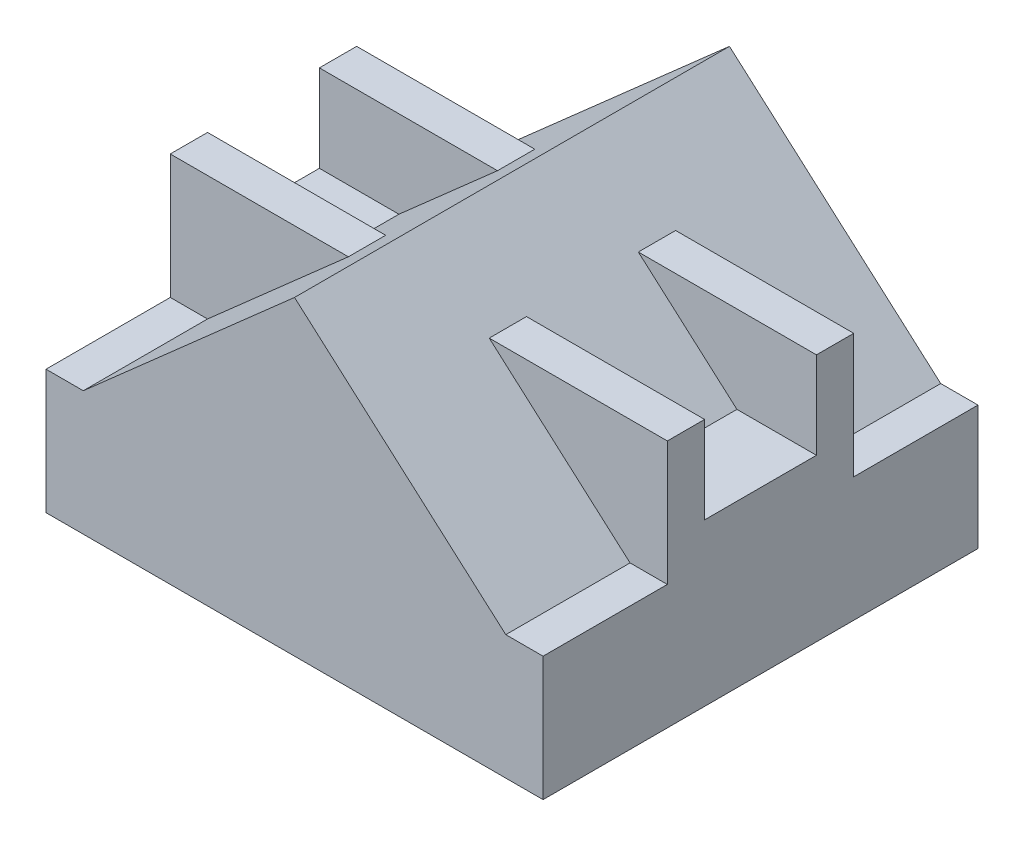
ISO-10303-21;
HEADER;
FILE_DESCRIPTION(('STEP AP214'),'2;1');
FILE_NAME('part.step','',(''),(''),'','','');
FILE_SCHEMA(('AUTOMOTIVE_DESIGN { 1 0 10303 214 1 1 1 1 }'));
ENDSEC;
DATA;
#1=APPLICATION_CONTEXT('core data for automotive mechanical design processes');
#2=APPLICATION_PROTOCOL_DEFINITION('international standard','automotive_design',2000,#1);
#3=PRODUCT_CONTEXT('',#1,'mechanical');
#4=PRODUCT('Part','Part','',(#3));
#5=PRODUCT_RELATED_PRODUCT_CATEGORY('part','',(#4));
#6=PRODUCT_DEFINITION_FORMATION('','',#4);
#7=PRODUCT_DEFINITION_CONTEXT('part definition',#1,'design');
#8=PRODUCT_DEFINITION('design','',#6,#7);
#9=PRODUCT_DEFINITION_SHAPE('','',#8);
#10=(LENGTH_UNIT() NAMED_UNIT(*) SI_UNIT(.MILLI.,.METRE.));
#11=(NAMED_UNIT(*) PLANE_ANGLE_UNIT() SI_UNIT($,.RADIAN.));
#12=(NAMED_UNIT(*) SI_UNIT($,.STERADIAN.) SOLID_ANGLE_UNIT());
#13=UNCERTAINTY_MEASURE_WITH_UNIT(LENGTH_MEASURE(1.E-05),#10,'distance_accuracy_value','');
#14=(GEOMETRIC_REPRESENTATION_CONTEXT(3) GLOBAL_UNCERTAINTY_ASSIGNED_CONTEXT((#13)) GLOBAL_UNIT_ASSIGNED_CONTEXT((#10,
#11,#12)) REPRESENTATION_CONTEXT('',''));
#15=CARTESIAN_POINT('',(0.,0.,0.));
#16=DIRECTION('',(0.,0.,1.));
#17=DIRECTION('',(1.,0.,0.));
#18=AXIS2_PLACEMENT_3D('',#15,#16,#17);
#19=CARTESIAN_POINT('',(0.,50.,0.));
#20=DIRECTION('',(0.,1.,0.));
#21=DIRECTION('',(0.,0.,1.));
#22=AXIS2_PLACEMENT_3D('',#19,#20,#21);
#23=PLANE('',#22);
#24=DIRECTION('',(0.,0.,-1.));
#25=VECTOR('',#24,1.);
#26=CARTESIAN_POINT('',(-100.,50.,0.));
#27=LINE('',#26,#25);
#28=CARTESIAN_POINT('',(-100.,50.,-37.5));
#29=VERTEX_POINT('',#28);
#30=CARTESIAN_POINT('',(-100.,50.,-87.5));
#31=VERTEX_POINT('',#30);
#32=EDGE_CURVE('E63',#29,#31,#27,.T.);
#33=ORIENTED_EDGE('',*,*,#32,.F.);
#34=DIRECTION('',(-1.,0.,0.));
#35=VECTOR('',#34,1.);
#36=CARTESIAN_POINT('',(100.,50.,-37.5));
#37=LINE('',#36,#35);
#38=CARTESIAN_POINT('',(-85.,50.,-37.5));
#39=VERTEX_POINT('',#38);
#40=EDGE_CURVE('E226',#39,#29,#37,.T.);
#41=ORIENTED_EDGE('',*,*,#40,.F.);
#42=DIRECTION('',(0.,0.,1.));
#43=VECTOR('',#42,1.);
#44=CARTESIAN_POINT('',(-85.,50.,-87.5));
#45=LINE('',#44,#43);
#46=CARTESIAN_POINT('',(-85.,50.,-87.5));
#47=VERTEX_POINT('',#46);
#48=EDGE_CURVE('E257',#47,#39,#45,.T.);
#49=ORIENTED_EDGE('',*,*,#48,.F.);
#50=DIRECTION('',(-1.,0.,0.));
#51=VECTOR('',#50,1.);
#52=CARTESIAN_POINT('',(0.,50.,-87.5));
#53=LINE('',#52,#51);
#54=EDGE_CURVE('E239',#47,#31,#53,.T.);
#55=ORIENTED_EDGE('',*,*,#54,.T.);
#56=EDGE_LOOP('',(#33,#41,#49,#55));
#57=FACE_BOUND('',#56,.T.);
#58=ADVANCED_FACE('F47',(#57),#23,.T.);
#59=CARTESIAN_POINT('',(-85.,50.,37.5));
#60=VERTEX_POINT('',#59);
#61=CARTESIAN_POINT('',(-85.,50.,87.5));
#62=VERTEX_POINT('',#61);
#63=EDGE_CURVE('E370',#60,#62,#45,.T.);
#64=ORIENTED_EDGE('',*,*,#63,.F.);
#65=DIRECTION('',(-1.,0.,0.));
#66=VECTOR('',#65,1.);
#67=CARTESIAN_POINT('',(100.,50.,37.5));
#68=LINE('',#67,#66);
#69=CARTESIAN_POINT('',(-100.,50.,37.5));
#70=VERTEX_POINT('',#69);
#71=EDGE_CURVE('E71',#60,#70,#68,.T.);
#72=ORIENTED_EDGE('',*,*,#71,.T.);
#73=CARTESIAN_POINT('',(-100.,50.,87.5));
#74=VERTEX_POINT('',#73);
#75=EDGE_CURVE('E248',#74,#70,#27,.T.);
#76=ORIENTED_EDGE('',*,*,#75,.F.);
#77=DIRECTION('',(-1.,0.,0.));
#78=VECTOR('',#77,1.);
#79=CARTESIAN_POINT('',(0.,50.,87.5));
#80=LINE('',#79,#78);
#81=EDGE_CURVE('E241',#62,#74,#80,.T.);
#82=ORIENTED_EDGE('',*,*,#81,.F.);
#83=EDGE_LOOP('',(#64,#72,#76,#82));
#84=FACE_BOUND('',#83,.T.);
#85=ADVANCED_FACE('F496',(#84),#23,.T.);
#86=DIRECTION('',(0.,0.,1.));
#87=VECTOR('',#86,1.);
#88=CARTESIAN_POINT('',(85.,50.,-87.5));
#89=LINE('',#88,#87);
#90=CARTESIAN_POINT('',(85.,50.,-87.5));
#91=VERTEX_POINT('',#90);
#92=CARTESIAN_POINT('',(85.,50.,-37.5));
#93=VERTEX_POINT('',#92);
#94=EDGE_CURVE('E223',#91,#93,#89,.T.);
#95=ORIENTED_EDGE('',*,*,#94,.T.);
#96=CARTESIAN_POINT('',(100.,50.,-37.5));
#97=VERTEX_POINT('',#96);
#98=EDGE_CURVE('E207',#97,#93,#37,.T.);
#99=ORIENTED_EDGE('',*,*,#98,.F.);
#100=DIRECTION('',(0.,0.,-1.));
#101=VECTOR('',#100,1.);
#102=CARTESIAN_POINT('',(100.,50.,0.));
#103=LINE('',#102,#101);
#104=CARTESIAN_POINT('',(100.,50.,-87.5));
#105=VERTEX_POINT('',#104);
#106=EDGE_CURVE('E221',#97,#105,#103,.T.);
#107=ORIENTED_EDGE('',*,*,#106,.T.);
#108=EDGE_CURVE('E245',#105,#91,#53,.T.);
#109=ORIENTED_EDGE('',*,*,#108,.T.);
#110=EDGE_LOOP('',(#95,#99,#107,#109));
#111=FACE_BOUND('',#110,.T.);
#112=ADVANCED_FACE('F219',(#111),#23,.T.);
#113=CARTESIAN_POINT('',(100.,50.,87.5));
#114=VERTEX_POINT('',#113);
#115=CARTESIAN_POINT('',(100.,50.,37.5));
#116=VERTEX_POINT('',#115);
#117=EDGE_CURVE('E233',#114,#116,#103,.T.);
#118=ORIENTED_EDGE('',*,*,#117,.T.);
#119=CARTESIAN_POINT('',(85.,50.,37.5));
#120=VERTEX_POINT('',#119);
#121=EDGE_CURVE('E382',#116,#120,#68,.T.);
#122=ORIENTED_EDGE('',*,*,#121,.T.);
#123=CARTESIAN_POINT('',(85.,50.,87.5));
#124=VERTEX_POINT('',#123);
#125=EDGE_CURVE('E360',#120,#124,#89,.T.);
#126=ORIENTED_EDGE('',*,*,#125,.T.);
#127=EDGE_CURVE('E234',#114,#124,#80,.T.);
#128=ORIENTED_EDGE('',*,*,#127,.F.);
#129=EDGE_LOOP('',(#118,#122,#126,#128));
#130=FACE_BOUND('',#129,.T.);
#131=ADVANCED_FACE('F380',(#130),#23,.T.);
#132=CARTESIAN_POINT('',(-85.,50.,-87.5));
#133=DIRECTION('',(0.661621637086846,-0.749837855365093,0.));
#134=DIRECTION('',(0.749837855365093,0.661621637086846,0.));
#135=AXIS2_PLACEMENT_3D('',#132,#133,#134);
#136=PLANE('',#135);
#137=DIRECTION('',(-0.749837855365093,-0.661621637086846,0.));
#138=VECTOR('',#137,1.);
#139=CARTESIAN_POINT('',(-85.,50.,-37.5));
#140=LINE('',#139,#138);
#141=CARTESIAN_POINT('',(-28.3333333333333,100.,-37.5));
#142=VERTEX_POINT('',#141);
#143=EDGE_CURVE('E347',#142,#39,#140,.T.);
#144=ORIENTED_EDGE('',*,*,#143,.F.);
#145=DIRECTION('',(0.,0.,-1.));
#146=VECTOR('',#145,1.);
#147=CARTESIAN_POINT('',(-28.3333333333333,100.,-87.5));
#148=LINE('',#147,#146);
#149=CARTESIAN_POINT('',(-28.3333333333333,100.,-22.5));
#150=VERTEX_POINT('',#149);
#151=EDGE_CURVE('E343',#150,#142,#148,.T.);
#152=ORIENTED_EDGE('',*,*,#151,.F.);
#153=DIRECTION('',(0.749837855365093,0.661621637086846,0.));
#154=VECTOR('',#153,1.);
#155=CARTESIAN_POINT('',(-85.,50.,-22.5));
#156=LINE('',#155,#154);
#157=CARTESIAN_POINT('',(-68.,65.,-22.5));
#158=VERTEX_POINT('',#157);
#159=EDGE_CURVE('E339',#158,#150,#156,.T.);
#160=ORIENTED_EDGE('',*,*,#159,.F.);
#161=DIRECTION('',(0.,0.,-1.));
#162=VECTOR('',#161,1.);
#163=CARTESIAN_POINT('',(-68.,65.,-87.5));
#164=LINE('',#163,#162);
#165=CARTESIAN_POINT('',(-68.,65.,22.5));
#166=VERTEX_POINT('',#165);
#167=EDGE_CURVE('E335',#166,#158,#164,.T.);
#168=ORIENTED_EDGE('',*,*,#167,.F.);
#169=DIRECTION('',(-0.749837855365093,-0.661621637086846,0.));
#170=VECTOR('',#169,1.);
#171=CARTESIAN_POINT('',(-85.,50.,22.5));
#172=LINE('',#171,#170);
#173=CARTESIAN_POINT('',(-28.3333333333333,100.,22.5));
#174=VERTEX_POINT('',#173);
#175=EDGE_CURVE('E331',#174,#166,#172,.T.);
#176=ORIENTED_EDGE('',*,*,#175,.F.);
#177=DIRECTION('',(0.,0.,-1.));
#178=VECTOR('',#177,1.);
#179=CARTESIAN_POINT('',(-28.3333333333333,100.,-87.5));
#180=LINE('',#179,#178);
#181=CARTESIAN_POINT('',(-28.3333333333333,100.,37.5));
#182=VERTEX_POINT('',#181);
#183=EDGE_CURVE('E327',#182,#174,#180,.T.);
#184=ORIENTED_EDGE('',*,*,#183,.F.);
#185=DIRECTION('',(0.749837855365093,0.661621637086846,0.));
#186=VECTOR('',#185,1.);
#187=CARTESIAN_POINT('',(-85.,50.,37.5));
#188=LINE('',#187,#186);
#189=EDGE_CURVE('E225',#60,#182,#188,.T.);
#190=ORIENTED_EDGE('',*,*,#189,.F.);
#191=ORIENTED_EDGE('',*,*,#63,.T.);
#192=DIRECTION('',(0.749837855365093,0.661621637086846,0.));
#193=VECTOR('',#192,1.);
#194=CARTESIAN_POINT('',(-85.,50.,87.5));
#195=LINE('',#194,#193);
#196=CARTESIAN_POINT('',(0.,125.,87.5));
#197=VERTEX_POINT('',#196);
#198=EDGE_CURVE('E357',#62,#197,#195,.T.);
#199=ORIENTED_EDGE('',*,*,#198,.T.);
#200=DIRECTION('',(0.,0.,1.));
#201=VECTOR('',#200,1.);
#202=CARTESIAN_POINT('',(0.,125.,-87.5));
#203=LINE('',#202,#201);
#204=CARTESIAN_POINT('',(0.,125.,-87.5));
#205=VERTEX_POINT('',#204);
#206=EDGE_CURVE('E371',#205,#197,#203,.T.);
#207=ORIENTED_EDGE('',*,*,#206,.F.);
#208=DIRECTION('',(0.749837855365093,0.661621637086846,0.));
#209=VECTOR('',#208,1.);
#210=CARTESIAN_POINT('',(-85.,50.,-87.5));
#211=LINE('',#210,#209);
#212=EDGE_CURVE('E356',#47,#205,#211,.T.);
#213=ORIENTED_EDGE('',*,*,#212,.F.);
#214=ORIENTED_EDGE('',*,*,#48,.T.);
#215=EDGE_LOOP('',(#144,#152,#160,#168,#176,#184,#190,#191,#199,#207,#213,#214));
#216=FACE_BOUND('',#215,.T.);
#217=ADVANCED_FACE('F505',(#216),#136,.F.);
#218=CARTESIAN_POINT('',(85.,50.,-87.5));
#219=DIRECTION('',(0.661621637086846,0.749837855365093,0.));
#220=DIRECTION('',(-0.749837855365093,0.661621637086846,0.));
#221=AXIS2_PLACEMENT_3D('',#218,#219,#220);
#222=PLANE('',#221);
#223=DIRECTION('',(0.,0.,-1.));
#224=VECTOR('',#223,1.);
#225=CARTESIAN_POINT('',(28.3333333333333,100.,-87.5));
#226=LINE('',#225,#224);
#227=CARTESIAN_POINT('',(28.3333333333333,100.,-22.5));
#228=VERTEX_POINT('',#227);
#229=CARTESIAN_POINT('',(28.3333333333333,100.,-37.5));
#230=VERTEX_POINT('',#229);
#231=EDGE_CURVE('E56',#228,#230,#226,.T.);
#232=ORIENTED_EDGE('',*,*,#231,.T.);
#233=DIRECTION('',(0.749837855365093,-0.661621637086846,0.));
#234=VECTOR('',#233,1.);
#235=CARTESIAN_POINT('',(85.,50.,-37.5));
#236=LINE('',#235,#234);
#237=EDGE_CURVE('E11',#230,#93,#236,.T.);
#238=ORIENTED_EDGE('',*,*,#237,.T.);
#239=ORIENTED_EDGE('',*,*,#94,.F.);
#240=DIRECTION('',(-0.749837855365093,0.661621637086846,0.));
#241=VECTOR('',#240,1.);
#242=CARTESIAN_POINT('',(85.,50.,-87.5));
#243=LINE('',#242,#241);
#244=EDGE_CURVE('E352',#91,#205,#243,.T.);
#245=ORIENTED_EDGE('',*,*,#244,.T.);
#246=ORIENTED_EDGE('',*,*,#206,.T.);
#247=DIRECTION('',(-0.749837855365093,0.661621637086846,0.));
#248=VECTOR('',#247,1.);
#249=CARTESIAN_POINT('',(85.,50.,87.5));
#250=LINE('',#249,#248);
#251=EDGE_CURVE('E351',#124,#197,#250,.T.);
#252=ORIENTED_EDGE('',*,*,#251,.F.);
#253=ORIENTED_EDGE('',*,*,#125,.F.);
#254=DIRECTION('',(-0.749837855365093,0.661621637086846,0.));
#255=VECTOR('',#254,1.);
#256=CARTESIAN_POINT('',(85.,50.,37.5));
#257=LINE('',#256,#255);
#258=CARTESIAN_POINT('',(28.3333333333333,100.,37.5));
#259=VERTEX_POINT('',#258);
#260=EDGE_CURVE('E278',#120,#259,#257,.T.);
#261=ORIENTED_EDGE('',*,*,#260,.T.);
#262=DIRECTION('',(0.,0.,-1.));
#263=VECTOR('',#262,1.);
#264=CARTESIAN_POINT('',(28.3333333333333,100.,-87.5));
#265=LINE('',#264,#263);
#266=CARTESIAN_POINT('',(28.3333333333333,100.,22.5));
#267=VERTEX_POINT('',#266);
#268=EDGE_CURVE('E282',#259,#267,#265,.T.);
#269=ORIENTED_EDGE('',*,*,#268,.T.);
#270=DIRECTION('',(0.749837855365093,-0.661621637086846,0.));
#271=VECTOR('',#270,1.);
#272=CARTESIAN_POINT('',(85.,50.,22.5));
#273=LINE('',#272,#271);
#274=CARTESIAN_POINT('',(68.,65.,22.5));
#275=VERTEX_POINT('',#274);
#276=EDGE_CURVE('E286',#267,#275,#273,.T.);
#277=ORIENTED_EDGE('',*,*,#276,.T.);
#278=DIRECTION('',(0.,0.,-1.));
#279=VECTOR('',#278,1.);
#280=CARTESIAN_POINT('',(68.,65.,-87.5));
#281=LINE('',#280,#279);
#282=CARTESIAN_POINT('',(68.,65.,-22.5));
#283=VERTEX_POINT('',#282);
#284=EDGE_CURVE('E290',#275,#283,#281,.T.);
#285=ORIENTED_EDGE('',*,*,#284,.T.);
#286=DIRECTION('',(-0.749837855365093,0.661621637086846,0.));
#287=VECTOR('',#286,1.);
#288=CARTESIAN_POINT('',(85.,50.,-22.5));
#289=LINE('',#288,#287);
#290=EDGE_CURVE('E294',#283,#228,#289,.T.);
#291=ORIENTED_EDGE('',*,*,#290,.T.);
#292=EDGE_LOOP('',(#232,#238,#239,#245,#246,#252,#253,#261,#269,#277,#285,#291));
#293=FACE_BOUND('',#292,.T.);
#294=ADVANCED_FACE('F300',(#293),#222,.T.);
#295=CARTESIAN_POINT('',(0.,50.,87.5));
#296=DIRECTION('',(0.,0.,1.));
#297=DIRECTION('',(1.,0.,0.));
#298=AXIS2_PLACEMENT_3D('',#295,#296,#297);
#299=PLANE('',#298);
#300=ORIENTED_EDGE('',*,*,#127,.T.);
#301=ORIENTED_EDGE('',*,*,#251,.T.);
#302=ORIENTED_EDGE('',*,*,#198,.F.);
#303=ORIENTED_EDGE('',*,*,#81,.T.);
#304=DIRECTION('',(0.,-1.,0.));
#305=VECTOR('',#304,1.);
#306=CARTESIAN_POINT('',(-100.,50.,87.5));
#307=LINE('',#306,#305);
#308=CARTESIAN_POINT('',(-100.,0.,87.5));
#309=VERTEX_POINT('',#308);
#310=EDGE_CURVE('E251',#74,#309,#307,.T.);
#311=ORIENTED_EDGE('',*,*,#310,.T.);
#312=DIRECTION('',(-1.,0.,0.));
#313=VECTOR('',#312,1.);
#314=CARTESIAN_POINT('',(0.,0.,87.5));
#315=LINE('',#314,#313);
#316=CARTESIAN_POINT('',(100.,0.,87.5));
#317=VERTEX_POINT('',#316);
#318=EDGE_CURVE('E252',#317,#309,#315,.T.);
#319=ORIENTED_EDGE('',*,*,#318,.F.);
#320=DIRECTION('',(0.,-1.,0.));
#321=VECTOR('',#320,1.);
#322=CARTESIAN_POINT('',(100.,50.,87.5));
#323=LINE('',#322,#321);
#324=EDGE_CURVE('E275',#114,#317,#323,.T.);
#325=ORIENTED_EDGE('',*,*,#324,.F.);
#326=EDGE_LOOP('',(#300,#301,#302,#303,#311,#319,#325));
#327=FACE_BOUND('',#326,.T.);
#328=ADVANCED_FACE('F49',(#327),#299,.T.);
#329=CARTESIAN_POINT('',(100.,50.,0.));
#330=DIRECTION('',(-1.,0.,0.));
#331=DIRECTION('',(0.,0.,1.));
#332=AXIS2_PLACEMENT_3D('',#329,#330,#331);
#333=PLANE('',#332);
#334=DIRECTION('',(0.,0.,-1.));
#335=VECTOR('',#334,1.);
#336=CARTESIAN_POINT('',(100.,0.,0.));
#337=LINE('',#336,#335);
#338=CARTESIAN_POINT('',(100.,0.,-87.5));
#339=VERTEX_POINT('',#338);
#340=EDGE_CURVE('E256',#317,#339,#337,.T.);
#341=ORIENTED_EDGE('',*,*,#340,.T.);
#342=DIRECTION('',(0.,-1.,0.));
#343=VECTOR('',#342,1.);
#344=CARTESIAN_POINT('',(100.,50.,-87.5));
#345=LINE('',#344,#343);
#346=EDGE_CURVE('E230',#105,#339,#345,.T.);
#347=ORIENTED_EDGE('',*,*,#346,.F.);
#348=ORIENTED_EDGE('',*,*,#106,.F.);
#349=DIRECTION('',(0.,1.,0.));
#350=VECTOR('',#349,1.);
#351=CARTESIAN_POINT('',(100.,100.,-37.5));
#352=LINE('',#351,#350);
#353=CARTESIAN_POINT('',(100.,100.,-37.5));
#354=VERTEX_POINT('',#353);
#355=EDGE_CURVE('E204',#97,#354,#352,.T.);
#356=ORIENTED_EDGE('',*,*,#355,.T.);
#357=DIRECTION('',(0.,0.,1.));
#358=VECTOR('',#357,1.);
#359=CARTESIAN_POINT('',(100.,100.,-22.5));
#360=LINE('',#359,#358);
#361=CARTESIAN_POINT('',(100.,100.,-22.5));
#362=VERTEX_POINT('',#361);
#363=EDGE_CURVE('E214',#354,#362,#360,.T.);
#364=ORIENTED_EDGE('',*,*,#363,.T.);
#365=DIRECTION('',(0.,-1.,0.));
#366=VECTOR('',#365,1.);
#367=CARTESIAN_POINT('',(100.,65.,-22.5));
#368=LINE('',#367,#366);
#369=CARTESIAN_POINT('',(100.,65.,-22.5));
#370=VERTEX_POINT('',#369);
#371=EDGE_CURVE('E311',#362,#370,#368,.T.);
#372=ORIENTED_EDGE('',*,*,#371,.T.);
#373=DIRECTION('',(0.,0.,1.));
#374=VECTOR('',#373,1.);
#375=CARTESIAN_POINT('',(100.,65.,22.5));
#376=LINE('',#375,#374);
#377=CARTESIAN_POINT('',(100.,65.,22.5));
#378=VERTEX_POINT('',#377);
#379=EDGE_CURVE('E467',#370,#378,#376,.T.);
#380=ORIENTED_EDGE('',*,*,#379,.T.);
#381=DIRECTION('',(0.,1.,0.));
#382=VECTOR('',#381,1.);
#383=CARTESIAN_POINT('',(100.,100.,22.5));
#384=LINE('',#383,#382);
#385=CARTESIAN_POINT('',(100.,100.,22.5));
#386=VERTEX_POINT('',#385);
#387=EDGE_CURVE('E464',#378,#386,#384,.T.);
#388=ORIENTED_EDGE('',*,*,#387,.T.);
#389=DIRECTION('',(0.,0.,1.));
#390=VECTOR('',#389,1.);
#391=CARTESIAN_POINT('',(100.,100.,37.5));
#392=LINE('',#391,#390);
#393=CARTESIAN_POINT('',(100.,100.,37.5));
#394=VERTEX_POINT('',#393);
#395=EDGE_CURVE('E392',#386,#394,#392,.T.);
#396=ORIENTED_EDGE('',*,*,#395,.T.);
#397=DIRECTION('',(0.,-1.,0.));
#398=VECTOR('',#397,1.);
#399=CARTESIAN_POINT('',(100.,50.,37.5));
#400=LINE('',#399,#398);
#401=EDGE_CURVE('E390',#394,#116,#400,.T.);
#402=ORIENTED_EDGE('',*,*,#401,.T.);
#403=ORIENTED_EDGE('',*,*,#117,.F.);
#404=ORIENTED_EDGE('',*,*,#324,.T.);
#405=EDGE_LOOP('',(#341,#347,#348,#356,#364,#372,#380,#388,#396,#402,#403,#404));
#406=FACE_BOUND('',#405,.T.);
#407=ADVANCED_FACE('F228',(#406),#333,.F.);
#408=CARTESIAN_POINT('',(0.,50.,-87.5));
#409=DIRECTION('',(0.,0.,1.));
#410=DIRECTION('',(1.,0.,0.));
#411=AXIS2_PLACEMENT_3D('',#408,#409,#410);
#412=PLANE('',#411);
#413=ORIENTED_EDGE('',*,*,#54,.F.);
#414=ORIENTED_EDGE('',*,*,#212,.T.);
#415=ORIENTED_EDGE('',*,*,#244,.F.);
#416=ORIENTED_EDGE('',*,*,#108,.F.);
#417=ORIENTED_EDGE('',*,*,#346,.T.);
#418=DIRECTION('',(-1.,0.,0.));
#419=VECTOR('',#418,1.);
#420=CARTESIAN_POINT('',(0.,0.,-87.5));
#421=LINE('',#420,#419);
#422=CARTESIAN_POINT('',(-100.,0.,-87.5));
#423=VERTEX_POINT('',#422);
#424=EDGE_CURVE('E260',#339,#423,#421,.T.);
#425=ORIENTED_EDGE('',*,*,#424,.T.);
#426=DIRECTION('',(0.,-1.,0.));
#427=VECTOR('',#426,1.);
#428=CARTESIAN_POINT('',(-100.,50.,-87.5));
#429=LINE('',#428,#427);
#430=EDGE_CURVE('E270',#31,#423,#429,.T.);
#431=ORIENTED_EDGE('',*,*,#430,.F.);
#432=EDGE_LOOP('',(#413,#414,#415,#416,#417,#425,#431));
#433=FACE_BOUND('',#432,.T.);
#434=ADVANCED_FACE('F650',(#433),#412,.F.);
#435=CARTESIAN_POINT('',(-100.,50.,0.));
#436=DIRECTION('',(-1.,0.,0.));
#437=DIRECTION('',(0.,0.,1.));
#438=AXIS2_PLACEMENT_3D('',#435,#436,#437);
#439=PLANE('',#438);
#440=DIRECTION('',(0.,0.,-1.));
#441=VECTOR('',#440,1.);
#442=CARTESIAN_POINT('',(-100.,0.,0.));
#443=LINE('',#442,#441);
#444=EDGE_CURVE('E264',#309,#423,#443,.T.);
#445=ORIENTED_EDGE('',*,*,#444,.F.);
#446=ORIENTED_EDGE('',*,*,#310,.F.);
#447=ORIENTED_EDGE('',*,*,#75,.T.);
#448=DIRECTION('',(0.,-1.,0.));
#449=VECTOR('',#448,1.);
#450=CARTESIAN_POINT('',(-100.,50.,37.5));
#451=LINE('',#450,#449);
#452=CARTESIAN_POINT('',(-100.,100.,37.5));
#453=VERTEX_POINT('',#452);
#454=EDGE_CURVE('E215',#453,#70,#451,.T.);
#455=ORIENTED_EDGE('',*,*,#454,.F.);
#456=DIRECTION('',(0.,0.,1.));
#457=VECTOR('',#456,1.);
#458=CARTESIAN_POINT('',(-100.,100.,37.5));
#459=LINE('',#458,#457);
#460=CARTESIAN_POINT('',(-100.,100.,22.5));
#461=VERTEX_POINT('',#460);
#462=EDGE_CURVE('E447',#461,#453,#459,.T.);
#463=ORIENTED_EDGE('',*,*,#462,.F.);
#464=DIRECTION('',(0.,1.,0.));
#465=VECTOR('',#464,1.);
#466=CARTESIAN_POINT('',(-100.,100.,22.5));
#467=LINE('',#466,#465);
#468=CARTESIAN_POINT('',(-100.,65.,22.5));
#469=VERTEX_POINT('',#468);
#470=EDGE_CURVE('E430',#469,#461,#467,.T.);
#471=ORIENTED_EDGE('',*,*,#470,.F.);
#472=DIRECTION('',(0.,0.,1.));
#473=VECTOR('',#472,1.);
#474=CARTESIAN_POINT('',(-100.,65.,22.5));
#475=LINE('',#474,#473);
#476=CARTESIAN_POINT('',(-100.,65.,-22.5));
#477=VERTEX_POINT('',#476);
#478=EDGE_CURVE('E434',#477,#469,#475,.T.);
#479=ORIENTED_EDGE('',*,*,#478,.F.);
#480=DIRECTION('',(0.,-1.,0.));
#481=VECTOR('',#480,1.);
#482=CARTESIAN_POINT('',(-100.,65.,-22.5));
#483=LINE('',#482,#481);
#484=CARTESIAN_POINT('',(-100.,100.,-22.5));
#485=VERTEX_POINT('',#484);
#486=EDGE_CURVE('E441',#485,#477,#483,.T.);
#487=ORIENTED_EDGE('',*,*,#486,.F.);
#488=DIRECTION('',(0.,0.,1.));
#489=VECTOR('',#488,1.);
#490=CARTESIAN_POINT('',(-100.,100.,-22.5));
#491=LINE('',#490,#489);
#492=CARTESIAN_POINT('',(-100.,100.,-37.5));
#493=VERTEX_POINT('',#492);
#494=EDGE_CURVE('E454',#493,#485,#491,.T.);
#495=ORIENTED_EDGE('',*,*,#494,.F.);
#496=DIRECTION('',(0.,1.,0.));
#497=VECTOR('',#496,1.);
#498=CARTESIAN_POINT('',(-100.,100.,-37.5));
#499=LINE('',#498,#497);
#500=EDGE_CURVE('E458',#29,#493,#499,.T.);
#501=ORIENTED_EDGE('',*,*,#500,.F.);
#502=ORIENTED_EDGE('',*,*,#32,.T.);
#503=ORIENTED_EDGE('',*,*,#430,.T.);
#504=EDGE_LOOP('',(#445,#446,#447,#455,#463,#471,#479,#487,#495,#501,#502,#503));
#505=FACE_BOUND('',#504,.T.);
#506=ADVANCED_FACE('F444',(#505),#439,.T.);
#507=CARTESIAN_POINT('',(0.,0.,0.));
#508=DIRECTION('',(0.,1.,0.));
#509=DIRECTION('',(0.,0.,1.));
#510=AXIS2_PLACEMENT_3D('',#507,#508,#509);
#511=PLANE('',#510);
#512=ORIENTED_EDGE('',*,*,#318,.T.);
#513=ORIENTED_EDGE('',*,*,#444,.T.);
#514=ORIENTED_EDGE('',*,*,#424,.F.);
#515=ORIENTED_EDGE('',*,*,#340,.F.);
#516=EDGE_LOOP('',(#512,#513,#514,#515));
#517=FACE_BOUND('',#516,.T.);
#518=ADVANCED_FACE('F490',(#517),#511,.F.);
#519=CARTESIAN_POINT('',(100.,50.,37.5));
#520=DIRECTION('',(0.,0.,-1.));
#521=DIRECTION('',(-1.,0.,0.));
#522=AXIS2_PLACEMENT_3D('',#519,#520,#521);
#523=PLANE('',#522);
#524=ORIENTED_EDGE('',*,*,#260,.F.);
#525=ORIENTED_EDGE('',*,*,#121,.F.);
#526=ORIENTED_EDGE('',*,*,#401,.F.);
#527=DIRECTION('',(-1.,0.,0.));
#528=VECTOR('',#527,1.);
#529=CARTESIAN_POINT('',(100.,100.,37.5));
#530=LINE('',#529,#528);
#531=EDGE_CURVE('E403',#394,#259,#530,.T.);
#532=ORIENTED_EDGE('',*,*,#531,.T.);
#533=EDGE_LOOP('',(#524,#525,#526,#532));
#534=FACE_BOUND('',#533,.T.);
#535=ADVANCED_FACE('F397',(#534),#523,.F.);
#536=CARTESIAN_POINT('',(100.,100.,37.5));
#537=DIRECTION('',(0.,-1.,0.));
#538=DIRECTION('',(0.,0.,-1.));
#539=AXIS2_PLACEMENT_3D('',#536,#537,#538);
#540=PLANE('',#539);
#541=ORIENTED_EDGE('',*,*,#268,.F.);
#542=ORIENTED_EDGE('',*,*,#531,.F.);
#543=ORIENTED_EDGE('',*,*,#395,.F.);
#544=DIRECTION('',(-1.,0.,0.));
#545=VECTOR('',#544,1.);
#546=CARTESIAN_POINT('',(100.,100.,22.5));
#547=LINE('',#546,#545);
#548=EDGE_CURVE('E410',#386,#267,#547,.T.);
#549=ORIENTED_EDGE('',*,*,#548,.T.);
#550=EDGE_LOOP('',(#541,#542,#543,#549));
#551=FACE_BOUND('',#550,.T.);
#552=ADVANCED_FACE('F481',(#551),#540,.F.);
#553=CARTESIAN_POINT('',(100.,100.,22.5));
#554=DIRECTION('',(0.,0.,1.));
#555=DIRECTION('',(0.,-1.,0.));
#556=AXIS2_PLACEMENT_3D('',#553,#554,#555);
#557=PLANE('',#556);
#558=ORIENTED_EDGE('',*,*,#276,.F.);
#559=ORIENTED_EDGE('',*,*,#548,.F.);
#560=ORIENTED_EDGE('',*,*,#387,.F.);
#561=DIRECTION('',(-1.,0.,0.));
#562=VECTOR('',#561,1.);
#563=CARTESIAN_POINT('',(100.,65.,22.5));
#564=LINE('',#563,#562);
#565=EDGE_CURVE('E414',#378,#275,#564,.T.);
#566=ORIENTED_EDGE('',*,*,#565,.T.);
#567=EDGE_LOOP('',(#558,#559,#560,#566));
#568=FACE_BOUND('',#567,.T.);
#569=ADVANCED_FACE('F478',(#568),#557,.F.);
#570=CARTESIAN_POINT('',(100.,65.,22.5));
#571=DIRECTION('',(0.,-1.,0.));
#572=DIRECTION('',(0.,0.,-1.));
#573=AXIS2_PLACEMENT_3D('',#570,#571,#572);
#574=PLANE('',#573);
#575=ORIENTED_EDGE('',*,*,#284,.F.);
#576=ORIENTED_EDGE('',*,*,#565,.F.);
#577=ORIENTED_EDGE('',*,*,#379,.F.);
#578=DIRECTION('',(-1.,0.,0.));
#579=VECTOR('',#578,1.);
#580=CARTESIAN_POINT('',(100.,65.,-22.5));
#581=LINE('',#580,#579);
#582=EDGE_CURVE('E319',#370,#283,#581,.T.);
#583=ORIENTED_EDGE('',*,*,#582,.T.);
#584=EDGE_LOOP('',(#575,#576,#577,#583));
#585=FACE_BOUND('',#584,.T.);
#586=ADVANCED_FACE('F476',(#585),#574,.F.);
#587=CARTESIAN_POINT('',(100.,65.,-22.5));
#588=DIRECTION('',(0.,0.,-1.));
#589=DIRECTION('',(-1.,0.,0.));
#590=AXIS2_PLACEMENT_3D('',#587,#588,#589);
#591=PLANE('',#590);
#592=ORIENTED_EDGE('',*,*,#290,.F.);
#593=ORIENTED_EDGE('',*,*,#582,.F.);
#594=ORIENTED_EDGE('',*,*,#371,.F.);
#595=DIRECTION('',(-1.,0.,0.));
#596=VECTOR('',#595,1.);
#597=CARTESIAN_POINT('',(100.,100.,-22.5));
#598=LINE('',#597,#596);
#599=EDGE_CURVE('E305',#362,#228,#598,.T.);
#600=ORIENTED_EDGE('',*,*,#599,.T.);
#601=EDGE_LOOP('',(#592,#593,#594,#600));
#602=FACE_BOUND('',#601,.T.);
#603=ADVANCED_FACE('F308',(#602),#591,.F.);
#604=CARTESIAN_POINT('',(100.,100.,-22.5));
#605=DIRECTION('',(0.,-1.,0.));
#606=DIRECTION('',(0.,0.,-1.));
#607=AXIS2_PLACEMENT_3D('',#604,#605,#606);
#608=PLANE('',#607);
#609=ORIENTED_EDGE('',*,*,#231,.F.);
#610=ORIENTED_EDGE('',*,*,#599,.F.);
#611=ORIENTED_EDGE('',*,*,#363,.F.);
#612=DIRECTION('',(-1.,0.,0.));
#613=VECTOR('',#612,1.);
#614=CARTESIAN_POINT('',(100.,100.,-37.5));
#615=LINE('',#614,#613);
#616=EDGE_CURVE('E209',#354,#230,#615,.T.);
#617=ORIENTED_EDGE('',*,*,#616,.T.);
#618=EDGE_LOOP('',(#609,#610,#611,#617));
#619=FACE_BOUND('',#618,.T.);
#620=ADVANCED_FACE('F304',(#619),#608,.F.);
#621=CARTESIAN_POINT('',(100.,100.,-37.5));
#622=DIRECTION('',(0.,0.,1.));
#623=DIRECTION('',(0.,-1.,0.));
#624=AXIS2_PLACEMENT_3D('',#621,#622,#623);
#625=PLANE('',#624);
#626=ORIENTED_EDGE('',*,*,#237,.F.);
#627=ORIENTED_EDGE('',*,*,#616,.F.);
#628=ORIENTED_EDGE('',*,*,#355,.F.);
#629=ORIENTED_EDGE('',*,*,#98,.T.);
#630=EDGE_LOOP('',(#626,#627,#628,#629));
#631=FACE_BOUND('',#630,.T.);
#632=ADVANCED_FACE('F206',(#631),#625,.F.);
#633=EDGE_CURVE('E313',#142,#493,#615,.T.);
#634=ORIENTED_EDGE('',*,*,#633,.F.);
#635=ORIENTED_EDGE('',*,*,#143,.T.);
#636=ORIENTED_EDGE('',*,*,#40,.T.);
#637=ORIENTED_EDGE('',*,*,#500,.T.);
#638=EDGE_LOOP('',(#634,#635,#636,#637));
#639=FACE_BOUND('',#638,.T.);
#640=ADVANCED_FACE('F573',(#639),#625,.F.);
#641=EDGE_CURVE('E314',#150,#485,#598,.T.);
#642=ORIENTED_EDGE('',*,*,#641,.F.);
#643=ORIENTED_EDGE('',*,*,#151,.T.);
#644=ORIENTED_EDGE('',*,*,#633,.T.);
#645=ORIENTED_EDGE('',*,*,#494,.T.);
#646=EDGE_LOOP('',(#642,#643,#644,#645));
#647=FACE_BOUND('',#646,.T.);
#648=ADVANCED_FACE('F566',(#647),#608,.F.);
#649=EDGE_CURVE('E417',#158,#477,#581,.T.);
#650=ORIENTED_EDGE('',*,*,#649,.F.);
#651=ORIENTED_EDGE('',*,*,#159,.T.);
#652=ORIENTED_EDGE('',*,*,#641,.T.);
#653=ORIENTED_EDGE('',*,*,#486,.T.);
#654=EDGE_LOOP('',(#650,#651,#652,#653));
#655=FACE_BOUND('',#654,.T.);
#656=ADVANCED_FACE('F558',(#655),#591,.F.);
#657=EDGE_CURVE('E413',#166,#469,#564,.T.);
#658=ORIENTED_EDGE('',*,*,#657,.F.);
#659=ORIENTED_EDGE('',*,*,#167,.T.);
#660=ORIENTED_EDGE('',*,*,#649,.T.);
#661=ORIENTED_EDGE('',*,*,#478,.T.);
#662=EDGE_LOOP('',(#658,#659,#660,#661));
#663=FACE_BOUND('',#662,.T.);
#664=ADVANCED_FACE('F435',(#663),#574,.F.);
#665=EDGE_CURVE('E409',#174,#461,#547,.T.);
#666=ORIENTED_EDGE('',*,*,#665,.F.);
#667=ORIENTED_EDGE('',*,*,#175,.T.);
#668=ORIENTED_EDGE('',*,*,#657,.T.);
#669=ORIENTED_EDGE('',*,*,#470,.T.);
#670=EDGE_LOOP('',(#666,#667,#668,#669));
#671=FACE_BOUND('',#670,.T.);
#672=ADVANCED_FACE('F428',(#671),#557,.F.);
#673=EDGE_CURVE('E399',#182,#453,#530,.T.);
#674=ORIENTED_EDGE('',*,*,#673,.F.);
#675=ORIENTED_EDGE('',*,*,#183,.T.);
#676=ORIENTED_EDGE('',*,*,#665,.T.);
#677=ORIENTED_EDGE('',*,*,#462,.T.);
#678=EDGE_LOOP('',(#674,#675,#676,#677));
#679=FACE_BOUND('',#678,.T.);
#680=ADVANCED_FACE('F484',(#679),#540,.F.);
#681=ORIENTED_EDGE('',*,*,#71,.F.);
#682=ORIENTED_EDGE('',*,*,#189,.T.);
#683=ORIENTED_EDGE('',*,*,#673,.T.);
#684=ORIENTED_EDGE('',*,*,#454,.T.);
#685=EDGE_LOOP('',(#681,#682,#683,#684));
#686=FACE_BOUND('',#685,.T.);
#687=ADVANCED_FACE('F492',(#686),#523,.F.);
#688=CLOSED_SHELL('',(#58,#85,#112,#131,#217,#294,#328,#407,#434,#506,#518,#535,#552,#569,#586,
#603,#620,#632,#640,#648,#656,#664,#672,#680,#687));
#689=MANIFOLD_SOLID_BREP('B2',#688);
#690=ADVANCED_BREP_SHAPE_REPRESENTATION('',(#18,#689),#14);
#691=SHAPE_DEFINITION_REPRESENTATION(#9,#690);
ENDSEC;
END-ISO-10303-21;
